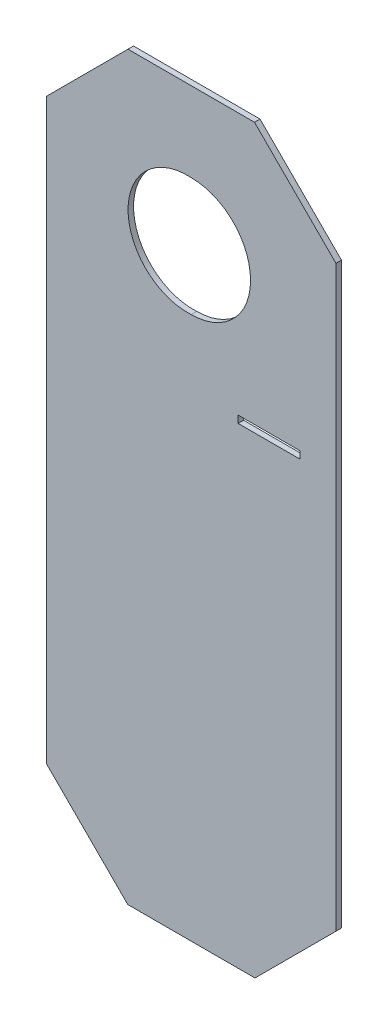
ISO-10303-21;
HEADER;
FILE_DESCRIPTION(('STEP AP214'),'2;1');
FILE_NAME('part.step','',(''),(''),'','','');
FILE_SCHEMA(('AUTOMOTIVE_DESIGN { 1 0 10303 214 1 1 1 1 }'));
ENDSEC;
DATA;
#1=APPLICATION_CONTEXT('core data for automotive mechanical design processes');
#2=APPLICATION_PROTOCOL_DEFINITION('international standard','automotive_design',2000,#1);
#3=PRODUCT_CONTEXT('',#1,'mechanical');
#4=PRODUCT('Part','Part','',(#3));
#5=PRODUCT_RELATED_PRODUCT_CATEGORY('part','',(#4));
#6=PRODUCT_DEFINITION_FORMATION('','',#4);
#7=PRODUCT_DEFINITION_CONTEXT('part definition',#1,'design');
#8=PRODUCT_DEFINITION('design','',#6,#7);
#9=PRODUCT_DEFINITION_SHAPE('','',#8);
#10=(LENGTH_UNIT() NAMED_UNIT(*) SI_UNIT(.MILLI.,.METRE.));
#11=(NAMED_UNIT(*) PLANE_ANGLE_UNIT() SI_UNIT($,.RADIAN.));
#12=(NAMED_UNIT(*) SI_UNIT($,.STERADIAN.) SOLID_ANGLE_UNIT());
#13=UNCERTAINTY_MEASURE_WITH_UNIT(LENGTH_MEASURE(1.E-05),#10,'distance_accuracy_value','');
#14=(GEOMETRIC_REPRESENTATION_CONTEXT(3) GLOBAL_UNCERTAINTY_ASSIGNED_CONTEXT((#13)) GLOBAL_UNIT_ASSIGNED_CONTEXT((#10,
#11,#12)) REPRESENTATION_CONTEXT('',''));
#15=CARTESIAN_POINT('',(0.,0.,0.));
#16=DIRECTION('',(0.,0.,1.));
#17=DIRECTION('',(1.,0.,0.));
#18=AXIS2_PLACEMENT_3D('',#15,#16,#17);
#19=CARTESIAN_POINT('',(105.082921558728,162.025080800368,4.));
#20=DIRECTION('',(-1.,0.,0.));
#21=DIRECTION('',(0.,-1.,0.));
#22=AXIS2_PLACEMENT_3D('',#19,#20,#21);
#23=PLANE('',#22);
#24=DIRECTION('',(0.,1.,0.));
#25=VECTOR('',#24,1.);
#26=CARTESIAN_POINT('',(105.082921558728,162.025080800368,0.));
#27=LINE('',#26,#25);
#28=CARTESIAN_POINT('',(105.082921558728,162.025080800368,0.));
#29=VERTEX_POINT('',#28);
#30=CARTESIAN_POINT('',(105.082921558728,581.722068253563,0.));
#31=VERTEX_POINT('',#30);
#32=EDGE_CURVE('E182',#29,#31,#27,.T.);
#33=ORIENTED_EDGE('',*,*,#32,.T.);
#34=DIRECTION('',(0.,0.,-1.));
#35=VECTOR('',#34,1.);
#36=CARTESIAN_POINT('',(105.082921558728,581.722068253563,4.));
#37=LINE('',#36,#35);
#38=CARTESIAN_POINT('',(105.082921558728,581.722068253563,4.));
#39=VERTEX_POINT('',#38);
#40=EDGE_CURVE('E11',#39,#31,#37,.T.);
#41=ORIENTED_EDGE('',*,*,#40,.F.);
#42=DIRECTION('',(0.,1.,0.));
#43=VECTOR('',#42,1.);
#44=CARTESIAN_POINT('',(105.082921558728,162.025080800368,4.));
#45=LINE('',#44,#43);
#46=CARTESIAN_POINT('',(105.082921558728,162.025080800368,4.));
#47=VERTEX_POINT('',#46);
#48=EDGE_CURVE('E185',#47,#39,#45,.T.);
#49=ORIENTED_EDGE('',*,*,#48,.F.);
#50=DIRECTION('',(0.,0.,-1.));
#51=VECTOR('',#50,1.);
#52=CARTESIAN_POINT('',(105.082921558728,162.025080800368,4.));
#53=LINE('',#52,#51);
#54=EDGE_CURVE('E203',#47,#29,#53,.T.);
#55=ORIENTED_EDGE('',*,*,#54,.T.);
#56=EDGE_LOOP('',(#33,#41,#49,#55));
#57=FACE_BOUND('',#56,.T.);
#58=ADVANCED_FACE('F32',(#57),#23,.F.);
#59=CARTESIAN_POINT('',(105.082921558728,581.722068253563,4.));
#60=DIRECTION('',(-0.707106781186548,-0.707106781186547,0.));
#61=DIRECTION('',(0.707106781186547,-0.707106781186548,0.));
#62=AXIS2_PLACEMENT_3D('',#59,#60,#61);
#63=PLANE('',#62);
#64=DIRECTION('',(-0.707106781186547,0.707106781186548,0.));
#65=VECTOR('',#64,1.);
#66=CARTESIAN_POINT('',(105.082921558728,581.722068253563,0.));
#67=LINE('',#66,#65);
#68=CARTESIAN_POINT('',(45.9790427486258,640.825947063665,0.));
#69=VERTEX_POINT('',#68);
#70=EDGE_CURVE('E206',#31,#69,#67,.T.);
#71=ORIENTED_EDGE('',*,*,#70,.T.);
#72=DIRECTION('',(0.,0.,-1.));
#73=VECTOR('',#72,1.);
#74=CARTESIAN_POINT('',(45.9790427486258,640.825947063665,4.));
#75=LINE('',#74,#73);
#76=CARTESIAN_POINT('',(45.9790427486258,640.825947063665,4.));
#77=VERTEX_POINT('',#76);
#78=EDGE_CURVE('E39',#77,#69,#75,.T.);
#79=ORIENTED_EDGE('',*,*,#78,.F.);
#80=DIRECTION('',(-0.707106781186547,0.707106781186548,0.));
#81=VECTOR('',#80,1.);
#82=CARTESIAN_POINT('',(105.082921558728,581.722068253563,4.));
#83=LINE('',#82,#81);
#84=EDGE_CURVE('E188',#39,#77,#83,.T.);
#85=ORIENTED_EDGE('',*,*,#84,.F.);
#86=ORIENTED_EDGE('',*,*,#40,.T.);
#87=EDGE_LOOP('',(#71,#79,#85,#86));
#88=FACE_BOUND('',#87,.T.);
#89=ADVANCED_FACE('F262',(#88),#63,.F.);
#90=CARTESIAN_POINT('',(45.9790427486258,640.825947063665,4.));
#91=DIRECTION('',(0.,-1.,0.));
#92=DIRECTION('',(1.,0.,0.));
#93=AXIS2_PLACEMENT_3D('',#90,#91,#92);
#94=PLANE('',#93);
#95=DIRECTION('',(-1.,0.,0.));
#96=VECTOR('',#95,1.);
#97=CARTESIAN_POINT('',(45.9790427486258,640.825947063665,0.));
#98=LINE('',#97,#96);
#99=CARTESIAN_POINT('',(-45.8131996311706,640.825947063664,0.));
#100=VERTEX_POINT('',#99);
#101=EDGE_CURVE('E208',#69,#100,#98,.T.);
#102=ORIENTED_EDGE('',*,*,#101,.T.);
#103=DIRECTION('',(0.,0.,-1.));
#104=VECTOR('',#103,1.);
#105=CARTESIAN_POINT('',(-45.8131996311706,640.825947063664,4.));
#106=LINE('',#105,#104);
#107=CARTESIAN_POINT('',(-45.8131996311706,640.825947063664,4.));
#108=VERTEX_POINT('',#107);
#109=EDGE_CURVE('E233',#108,#100,#106,.T.);
#110=ORIENTED_EDGE('',*,*,#109,.F.);
#111=DIRECTION('',(-1.,0.,0.));
#112=VECTOR('',#111,1.);
#113=CARTESIAN_POINT('',(45.9790427486258,640.825947063665,4.));
#114=LINE('',#113,#112);
#115=EDGE_CURVE('E191',#77,#108,#114,.T.);
#116=ORIENTED_EDGE('',*,*,#115,.F.);
#117=ORIENTED_EDGE('',*,*,#78,.T.);
#118=EDGE_LOOP('',(#102,#110,#116,#117));
#119=FACE_BOUND('',#118,.T.);
#120=ADVANCED_FACE('F240',(#119),#94,.F.);
#121=CARTESIAN_POINT('',(-45.8131996311706,640.825947063664,4.));
#122=DIRECTION('',(0.707106781186548,-0.707106781186547,0.));
#123=DIRECTION('',(0.707106781186547,0.707106781186548,0.));
#124=AXIS2_PLACEMENT_3D('',#121,#122,#123);
#125=PLANE('',#124);
#126=DIRECTION('',(-0.707106781186547,-0.707106781186548,0.));
#127=VECTOR('',#126,1.);
#128=CARTESIAN_POINT('',(-45.8131996311706,640.825947063664,0.));
#129=LINE('',#128,#127);
#130=CARTESIAN_POINT('',(-104.917078441272,581.722068253563,0.));
#131=VERTEX_POINT('',#130);
#132=EDGE_CURVE('E210',#100,#131,#129,.T.);
#133=ORIENTED_EDGE('',*,*,#132,.T.);
#134=DIRECTION('',(0.,0.,-1.));
#135=VECTOR('',#134,1.);
#136=CARTESIAN_POINT('',(-104.917078441272,581.722068253563,4.));
#137=LINE('',#136,#135);
#138=CARTESIAN_POINT('',(-104.917078441272,581.722068253563,4.));
#139=VERTEX_POINT('',#138);
#140=EDGE_CURVE('E230',#139,#131,#137,.T.);
#141=ORIENTED_EDGE('',*,*,#140,.F.);
#142=DIRECTION('',(-0.707106781186547,-0.707106781186548,0.));
#143=VECTOR('',#142,1.);
#144=CARTESIAN_POINT('',(-45.8131996311706,640.825947063664,4.));
#145=LINE('',#144,#143);
#146=EDGE_CURVE('E193',#108,#139,#145,.T.);
#147=ORIENTED_EDGE('',*,*,#146,.F.);
#148=ORIENTED_EDGE('',*,*,#109,.T.);
#149=EDGE_LOOP('',(#133,#141,#147,#148));
#150=FACE_BOUND('',#149,.T.);
#151=ADVANCED_FACE('F251',(#150),#125,.F.);
#152=CARTESIAN_POINT('',(-104.917078441272,581.722068253563,4.));
#153=DIRECTION('',(1.,0.,0.));
#154=DIRECTION('',(0.,1.,0.));
#155=AXIS2_PLACEMENT_3D('',#152,#153,#154);
#156=PLANE('',#155);
#157=DIRECTION('',(0.,-1.,0.));
#158=VECTOR('',#157,1.);
#159=CARTESIAN_POINT('',(-104.917078441272,581.722068253563,0.));
#160=LINE('',#159,#158);
#161=CARTESIAN_POINT('',(-104.917078441272,162.212880509357,0.));
#162=VERTEX_POINT('',#161);
#163=EDGE_CURVE('E212',#131,#162,#160,.T.);
#164=ORIENTED_EDGE('',*,*,#163,.T.);
#165=DIRECTION('',(0.,0.,-1.));
#166=VECTOR('',#165,1.);
#167=CARTESIAN_POINT('',(-104.917078441272,162.212880509357,4.));
#168=LINE('',#167,#166);
#169=CARTESIAN_POINT('',(-104.917078441272,162.212880509357,4.));
#170=VERTEX_POINT('',#169);
#171=EDGE_CURVE('E227',#170,#162,#168,.T.);
#172=ORIENTED_EDGE('',*,*,#171,.F.);
#173=DIRECTION('',(0.,-1.,0.));
#174=VECTOR('',#173,1.);
#175=CARTESIAN_POINT('',(-104.917078441272,581.722068253563,4.));
#176=LINE('',#175,#174);
#177=EDGE_CURVE('E195',#139,#170,#176,.T.);
#178=ORIENTED_EDGE('',*,*,#177,.F.);
#179=ORIENTED_EDGE('',*,*,#140,.T.);
#180=EDGE_LOOP('',(#164,#172,#178,#179));
#181=FACE_BOUND('',#180,.T.);
#182=ADVANCED_FACE('F255',(#181),#156,.F.);
#183=CARTESIAN_POINT('',(-104.917078441272,162.212880509357,4.));
#184=DIRECTION('',(0.707106781186547,0.707106781186547,0.));
#185=DIRECTION('',(-0.707106781186548,0.707106781186548,0.));
#186=AXIS2_PLACEMENT_3D('',#183,#184,#185);
#187=PLANE('',#186);
#188=DIRECTION('',(0.707106781186547,-0.707106781186547,0.));
#189=VECTOR('',#188,1.);
#190=CARTESIAN_POINT('',(-104.917078441272,162.212880509357,0.));
#191=LINE('',#190,#189);
#192=CARTESIAN_POINT('',(-45.973174510304,103.268976578389,0.));
#193=VERTEX_POINT('',#192);
#194=EDGE_CURVE('E214',#162,#193,#191,.T.);
#195=ORIENTED_EDGE('',*,*,#194,.T.);
#196=DIRECTION('',(0.,0.,-1.));
#197=VECTOR('',#196,1.);
#198=CARTESIAN_POINT('',(-45.973174510304,103.268976578389,4.));
#199=LINE('',#198,#197);
#200=CARTESIAN_POINT('',(-45.973174510304,103.268976578389,4.));
#201=VERTEX_POINT('',#200);
#202=EDGE_CURVE('E224',#201,#193,#199,.T.);
#203=ORIENTED_EDGE('',*,*,#202,.F.);
#204=DIRECTION('',(0.707106781186547,-0.707106781186547,0.));
#205=VECTOR('',#204,1.);
#206=CARTESIAN_POINT('',(-104.917078441272,162.212880509357,4.));
#207=LINE('',#206,#205);
#208=EDGE_CURVE('E197',#170,#201,#207,.T.);
#209=ORIENTED_EDGE('',*,*,#208,.F.);
#210=ORIENTED_EDGE('',*,*,#171,.T.);
#211=EDGE_LOOP('',(#195,#203,#209,#210));
#212=FACE_BOUND('',#211,.T.);
#213=ADVANCED_FACE('F275',(#212),#187,.F.);
#214=CARTESIAN_POINT('',(-45.973174510304,103.268976578389,4.));
#215=DIRECTION('',(0.,1.,0.));
#216=DIRECTION('',(0.,0.,1.));
#217=AXIS2_PLACEMENT_3D('',#214,#215,#216);
#218=PLANE('',#217);
#219=DIRECTION('',(1.,0.,0.));
#220=VECTOR('',#219,1.);
#221=CARTESIAN_POINT('',(-45.973174510304,103.268976578389,0.));
#222=LINE('',#221,#220);
#223=CARTESIAN_POINT('',(46.326817336749,103.268976578389,0.));
#224=VERTEX_POINT('',#223);
#225=EDGE_CURVE('E216',#193,#224,#222,.T.);
#226=ORIENTED_EDGE('',*,*,#225,.T.);
#227=DIRECTION('',(0.,0.,-1.));
#228=VECTOR('',#227,1.);
#229=CARTESIAN_POINT('',(46.326817336749,103.268976578389,4.));
#230=LINE('',#229,#228);
#231=CARTESIAN_POINT('',(46.326817336749,103.268976578389,4.));
#232=VERTEX_POINT('',#231);
#233=EDGE_CURVE('E221',#232,#224,#230,.T.);
#234=ORIENTED_EDGE('',*,*,#233,.F.);
#235=DIRECTION('',(1.,0.,0.));
#236=VECTOR('',#235,1.);
#237=CARTESIAN_POINT('',(-45.973174510304,103.268976578389,4.));
#238=LINE('',#237,#236);
#239=EDGE_CURVE('E199',#201,#232,#238,.T.);
#240=ORIENTED_EDGE('',*,*,#239,.F.);
#241=ORIENTED_EDGE('',*,*,#202,.T.);
#242=EDGE_LOOP('',(#226,#234,#240,#241));
#243=FACE_BOUND('',#242,.T.);
#244=ADVANCED_FACE('F273',(#243),#218,.F.);
#245=CARTESIAN_POINT('',(46.326817336749,103.268976578389,4.));
#246=DIRECTION('',(-0.707106781186548,0.707106781186547,0.));
#247=DIRECTION('',(-0.707106781186547,-0.707106781186548,0.));
#248=AXIS2_PLACEMENT_3D('',#245,#246,#247);
#249=PLANE('',#248);
#250=DIRECTION('',(0.707106781186547,0.707106781186548,0.));
#251=VECTOR('',#250,1.);
#252=CARTESIAN_POINT('',(46.326817336749,103.268976578389,0.));
#253=LINE('',#252,#251);
#254=EDGE_CURVE('E189',#224,#29,#253,.T.);
#255=ORIENTED_EDGE('',*,*,#254,.T.);
#256=ORIENTED_EDGE('',*,*,#54,.F.);
#257=DIRECTION('',(0.707106781186547,0.707106781186548,0.));
#258=VECTOR('',#257,1.);
#259=CARTESIAN_POINT('',(46.326817336749,103.268976578389,4.));
#260=LINE('',#259,#258);
#261=EDGE_CURVE('E201',#232,#47,#260,.T.);
#262=ORIENTED_EDGE('',*,*,#261,.F.);
#263=ORIENTED_EDGE('',*,*,#233,.T.);
#264=EDGE_LOOP('',(#255,#256,#262,#263));
#265=FACE_BOUND('',#264,.T.);
#266=ADVANCED_FACE('F268',(#265),#249,.F.);
#267=CARTESIAN_POINT('',(105.082921558728,640.825947063665,4.));
#268=DIRECTION('',(0.,0.,1.));
#269=DIRECTION('',(1.,0.,0.));
#270=AXIS2_PLACEMENT_3D('',#267,#268,#269);
#271=PLANE('',#270);
#272=DIRECTION('',(0.,1.,0.));
#273=VECTOR('',#272,1.);
#274=CARTESIAN_POINT('',(34.1142290983008,450.875896743529,4.));
#275=LINE('',#274,#273);
#276=CARTESIAN_POINT('',(34.1142290983008,445.625896743529,4.));
#277=VERTEX_POINT('',#276);
#278=CARTESIAN_POINT('',(34.1142290983008,450.875896743529,4.));
#279=VERTEX_POINT('',#278);
#280=EDGE_CURVE('E134',#277,#279,#275,.T.);
#281=ORIENTED_EDGE('',*,*,#280,.T.);
#282=DIRECTION('',(1.,0.,0.));
#283=VECTOR('',#282,1.);
#284=CARTESIAN_POINT('',(34.1142290983008,450.875896743529,4.));
#285=LINE('',#284,#283);
#286=CARTESIAN_POINT('',(79.1142290983008,450.875896743529,4.));
#287=VERTEX_POINT('',#286);
#288=EDGE_CURVE('E143',#279,#287,#285,.T.);
#289=ORIENTED_EDGE('',*,*,#288,.T.);
#290=DIRECTION('',(0.,-1.,0.));
#291=VECTOR('',#290,1.);
#292=CARTESIAN_POINT('',(79.1142290983008,450.875896743529,4.));
#293=LINE('',#292,#291);
#294=CARTESIAN_POINT('',(79.1142290983008,445.625896743529,4.));
#295=VERTEX_POINT('',#294);
#296=EDGE_CURVE('E46',#287,#295,#293,.T.);
#297=ORIENTED_EDGE('',*,*,#296,.T.);
#298=DIRECTION('',(-1.,0.,0.));
#299=VECTOR('',#298,1.);
#300=CARTESIAN_POINT('',(34.1142290983008,445.625896743529,4.));
#301=LINE('',#300,#299);
#302=EDGE_CURVE('E140',#295,#277,#301,.T.);
#303=ORIENTED_EDGE('',*,*,#302,.T.);
#304=EDGE_LOOP('',(#281,#289,#297,#303));
#305=FACE_BOUND('',#304,.T.);
#306=CARTESIAN_POINT('',(-2.67465205851429,540.024602251336,4.));
#307=DIRECTION('',(0.,0.,1.));
#308=DIRECTION('',(1.,0.,0.));
#309=AXIS2_PLACEMENT_3D('',#306,#307,#308);
#310=CIRCLE('',#309,43.090541621996);
#311=CARTESIAN_POINT('',(0.11726077625729,583.024602251336,4.));
#312=VERTEX_POINT('',#311);
#313=CARTESIAN_POINT('',(0.11726077625728,497.024602251336,4.));
#314=VERTEX_POINT('',#313);
#315=EDGE_CURVE('E165',#312,#314,#310,.T.);
#316=ORIENTED_EDGE('',*,*,#315,.F.);
#317=CARTESIAN_POINT('',(0.117260776257288,540.024602251336,4.));
#318=DIRECTION('',(0.,0.,1.));
#319=DIRECTION('',(1.,0.,0.));
#320=AXIS2_PLACEMENT_3D('',#317,#318,#319);
#321=CIRCLE('',#320,43.);
#322=EDGE_CURVE('E173',#314,#312,#321,.T.);
#323=ORIENTED_EDGE('',*,*,#322,.F.);
#324=EDGE_LOOP('',(#316,#323));
#325=FACE_BOUND('',#324,.T.);
#326=ORIENTED_EDGE('',*,*,#48,.T.);
#327=ORIENTED_EDGE('',*,*,#84,.T.);
#328=ORIENTED_EDGE('',*,*,#115,.T.);
#329=ORIENTED_EDGE('',*,*,#146,.T.);
#330=ORIENTED_EDGE('',*,*,#177,.T.);
#331=ORIENTED_EDGE('',*,*,#208,.T.);
#332=ORIENTED_EDGE('',*,*,#239,.T.);
#333=ORIENTED_EDGE('',*,*,#261,.T.);
#334=EDGE_LOOP('',(#326,#327,#328,#329,#330,#331,#332,#333));
#335=FACE_BOUND('',#334,.T.);
#336=ADVANCED_FACE('F147',(#305,#325,#335),#271,.T.);
#337=CARTESIAN_POINT('',(105.082921558728,640.825947063665,0.));
#338=DIRECTION('',(0.,0.,1.));
#339=DIRECTION('',(1.,0.,0.));
#340=AXIS2_PLACEMENT_3D('',#337,#338,#339);
#341=PLANE('',#340);
#342=DIRECTION('',(1.,0.,0.));
#343=VECTOR('',#342,1.);
#344=CARTESIAN_POINT('',(34.1142290983008,450.875896743529,0.));
#345=LINE('',#344,#343);
#346=CARTESIAN_POINT('',(34.1142290983008,450.875896743529,0.));
#347=VERTEX_POINT('',#346);
#348=CARTESIAN_POINT('',(79.1142290983008,450.875896743529,0.));
#349=VERTEX_POINT('',#348);
#350=EDGE_CURVE('E159',#347,#349,#345,.T.);
#351=ORIENTED_EDGE('',*,*,#350,.F.);
#352=DIRECTION('',(0.,1.,0.));
#353=VECTOR('',#352,1.);
#354=CARTESIAN_POINT('',(34.1142290983008,450.875896743529,0.));
#355=LINE('',#354,#353);
#356=CARTESIAN_POINT('',(34.1142290983008,445.625896743529,0.));
#357=VERTEX_POINT('',#356);
#358=EDGE_CURVE('E54',#357,#347,#355,.T.);
#359=ORIENTED_EDGE('',*,*,#358,.F.);
#360=DIRECTION('',(-1.,0.,0.));
#361=VECTOR('',#360,1.);
#362=CARTESIAN_POINT('',(34.1142290983008,445.625896743529,0.));
#363=LINE('',#362,#361);
#364=CARTESIAN_POINT('',(79.1142290983008,445.625896743529,0.));
#365=VERTEX_POINT('',#364);
#366=EDGE_CURVE('E150',#365,#357,#363,.T.);
#367=ORIENTED_EDGE('',*,*,#366,.F.);
#368=DIRECTION('',(0.,-1.,0.));
#369=VECTOR('',#368,1.);
#370=CARTESIAN_POINT('',(79.1142290983008,450.875896743529,0.));
#371=LINE('',#370,#369);
#372=EDGE_CURVE('E153',#349,#365,#371,.T.);
#373=ORIENTED_EDGE('',*,*,#372,.F.);
#374=EDGE_LOOP('',(#351,#359,#367,#373));
#375=FACE_BOUND('',#374,.T.);
#376=CARTESIAN_POINT('',(0.117260776257288,540.024602251336,0.));
#377=DIRECTION('',(0.,0.,1.));
#378=DIRECTION('',(1.,0.,0.));
#379=AXIS2_PLACEMENT_3D('',#376,#377,#378);
#380=CIRCLE('',#379,43.);
#381=CARTESIAN_POINT('',(0.11726077625728,497.024602251336,0.));
#382=VERTEX_POINT('',#381);
#383=CARTESIAN_POINT('',(0.11726077625729,583.024602251336,0.));
#384=VERTEX_POINT('',#383);
#385=EDGE_CURVE('E172',#382,#384,#380,.T.);
#386=ORIENTED_EDGE('',*,*,#385,.T.);
#387=CARTESIAN_POINT('',(-2.67465205851429,540.024602251336,0.));
#388=DIRECTION('',(0.,0.,1.));
#389=DIRECTION('',(1.,0.,0.));
#390=AXIS2_PLACEMENT_3D('',#387,#388,#389);
#391=CIRCLE('',#390,43.090541621996);
#392=EDGE_CURVE('E169',#384,#382,#391,.T.);
#393=ORIENTED_EDGE('',*,*,#392,.T.);
#394=EDGE_LOOP('',(#386,#393));
#395=FACE_BOUND('',#394,.T.);
#396=ORIENTED_EDGE('',*,*,#32,.F.);
#397=ORIENTED_EDGE('',*,*,#254,.F.);
#398=ORIENTED_EDGE('',*,*,#225,.F.);
#399=ORIENTED_EDGE('',*,*,#194,.F.);
#400=ORIENTED_EDGE('',*,*,#163,.F.);
#401=ORIENTED_EDGE('',*,*,#132,.F.);
#402=ORIENTED_EDGE('',*,*,#101,.F.);
#403=ORIENTED_EDGE('',*,*,#70,.F.);
#404=EDGE_LOOP('',(#396,#397,#398,#399,#400,#401,#402,#403));
#405=FACE_BOUND('',#404,.T.);
#406=ADVANCED_FACE('F246',(#375,#395,#405),#341,.F.);
#407=CARTESIAN_POINT('',(-2.67465205851429,540.024602251336,0.));
#408=DIRECTION('',(0.,0.,1.));
#409=DIRECTION('',(1.,0.,0.));
#410=AXIS2_PLACEMENT_3D('',#407,#408,#409);
#411=CYLINDRICAL_SURFACE('',#410,43.090541621996);
#412=ORIENTED_EDGE('',*,*,#315,.T.);
#413=DIRECTION('',(0.,0.,1.));
#414=VECTOR('',#413,1.);
#415=CARTESIAN_POINT('',(0.11726077625728,497.024602251336,0.));
#416=LINE('',#415,#414);
#417=EDGE_CURVE('E176',#382,#314,#416,.T.);
#418=ORIENTED_EDGE('',*,*,#417,.F.);
#419=ORIENTED_EDGE('',*,*,#392,.F.);
#420=DIRECTION('',(0.,0.,1.));
#421=VECTOR('',#420,1.);
#422=CARTESIAN_POINT('',(0.11726077625729,583.024602251336,0.));
#423=LINE('',#422,#421);
#424=EDGE_CURVE('E180',#384,#312,#423,.T.);
#425=ORIENTED_EDGE('',*,*,#424,.T.);
#426=EDGE_LOOP('',(#412,#418,#419,#425));
#427=FACE_BOUND('',#426,.T.);
#428=ADVANCED_FACE('F327',(#427),#411,.F.);
#429=CARTESIAN_POINT('',(0.117260776257288,540.024602251336,0.));
#430=DIRECTION('',(0.,0.,1.));
#431=DIRECTION('',(1.,0.,0.));
#432=AXIS2_PLACEMENT_3D('',#429,#430,#431);
#433=CYLINDRICAL_SURFACE('',#432,43.);
#434=ORIENTED_EDGE('',*,*,#322,.T.);
#435=ORIENTED_EDGE('',*,*,#424,.F.);
#436=ORIENTED_EDGE('',*,*,#385,.F.);
#437=ORIENTED_EDGE('',*,*,#417,.T.);
#438=EDGE_LOOP('',(#434,#435,#436,#437));
#439=FACE_BOUND('',#438,.T.);
#440=ADVANCED_FACE('F332',(#439),#433,.F.);
#441=CARTESIAN_POINT('',(34.1142290983008,450.875896743529,4.));
#442=DIRECTION('',(-1.,0.,0.));
#443=DIRECTION('',(0.,0.,1.));
#444=AXIS2_PLACEMENT_3D('',#441,#442,#443);
#445=PLANE('',#444);
#446=ORIENTED_EDGE('',*,*,#358,.T.);
#447=DIRECTION('',(0.,0.,-1.));
#448=VECTOR('',#447,1.);
#449=CARTESIAN_POINT('',(34.1142290983008,450.875896743529,4.));
#450=LINE('',#449,#448);
#451=EDGE_CURVE('E130',#279,#347,#450,.T.);
#452=ORIENTED_EDGE('',*,*,#451,.F.);
#453=ORIENTED_EDGE('',*,*,#280,.F.);
#454=DIRECTION('',(0.,0.,-1.));
#455=VECTOR('',#454,1.);
#456=CARTESIAN_POINT('',(34.1142290983008,445.625896743529,4.));
#457=LINE('',#456,#455);
#458=EDGE_CURVE('E163',#277,#357,#457,.T.);
#459=ORIENTED_EDGE('',*,*,#458,.T.);
#460=EDGE_LOOP('',(#446,#452,#453,#459));
#461=FACE_BOUND('',#460,.T.);
#462=ADVANCED_FACE('F132',(#461),#445,.F.);
#463=CARTESIAN_POINT('',(34.1142290983008,445.625896743529,4.));
#464=DIRECTION('',(0.,-1.,0.));
#465=DIRECTION('',(0.,0.,-1.));
#466=AXIS2_PLACEMENT_3D('',#463,#464,#465);
#467=PLANE('',#466);
#468=ORIENTED_EDGE('',*,*,#366,.T.);
#469=ORIENTED_EDGE('',*,*,#458,.F.);
#470=ORIENTED_EDGE('',*,*,#302,.F.);
#471=DIRECTION('',(0.,0.,-1.));
#472=VECTOR('',#471,1.);
#473=CARTESIAN_POINT('',(79.1142290983008,445.625896743529,4.));
#474=LINE('',#473,#472);
#475=EDGE_CURVE('E166',#295,#365,#474,.T.);
#476=ORIENTED_EDGE('',*,*,#475,.T.);
#477=EDGE_LOOP('',(#468,#469,#470,#476));
#478=FACE_BOUND('',#477,.T.);
#479=ADVANCED_FACE('F366',(#478),#467,.F.);
#480=CARTESIAN_POINT('',(79.1142290983008,450.875896743529,4.));
#481=DIRECTION('',(1.,0.,0.));
#482=DIRECTION('',(0.,0.,-1.));
#483=AXIS2_PLACEMENT_3D('',#480,#481,#482);
#484=PLANE('',#483);
#485=ORIENTED_EDGE('',*,*,#372,.T.);
#486=ORIENTED_EDGE('',*,*,#475,.F.);
#487=ORIENTED_EDGE('',*,*,#296,.F.);
#488=DIRECTION('',(0.,0.,-1.));
#489=VECTOR('',#488,1.);
#490=CARTESIAN_POINT('',(79.1142290983008,450.875896743529,4.));
#491=LINE('',#490,#489);
#492=EDGE_CURVE('E139',#287,#349,#491,.T.);
#493=ORIENTED_EDGE('',*,*,#492,.T.);
#494=EDGE_LOOP('',(#485,#486,#487,#493));
#495=FACE_BOUND('',#494,.T.);
#496=ADVANCED_FACE('F375',(#495),#484,.F.);
#497=CARTESIAN_POINT('',(34.1142290983008,450.875896743529,4.));
#498=DIRECTION('',(0.,1.,0.));
#499=DIRECTION('',(0.,0.,1.));
#500=AXIS2_PLACEMENT_3D('',#497,#498,#499);
#501=PLANE('',#500);
#502=ORIENTED_EDGE('',*,*,#350,.T.);
#503=ORIENTED_EDGE('',*,*,#492,.F.);
#504=ORIENTED_EDGE('',*,*,#288,.F.);
#505=ORIENTED_EDGE('',*,*,#451,.T.);
#506=EDGE_LOOP('',(#502,#503,#504,#505));
#507=FACE_BOUND('',#506,.T.);
#508=ADVANCED_FACE('F144',(#507),#501,.F.);
#509=CLOSED_SHELL('',(#58,#89,#120,#151,#182,#213,#244,#266,#336,#406,#428,#440,#462,#479,#496,#508));
#510=MANIFOLD_SOLID_BREP('B2',#509);
#511=ADVANCED_BREP_SHAPE_REPRESENTATION('',(#18,#510),#14);
#512=SHAPE_DEFINITION_REPRESENTATION(#9,#511);
ENDSEC;
END-ISO-10303-21;
